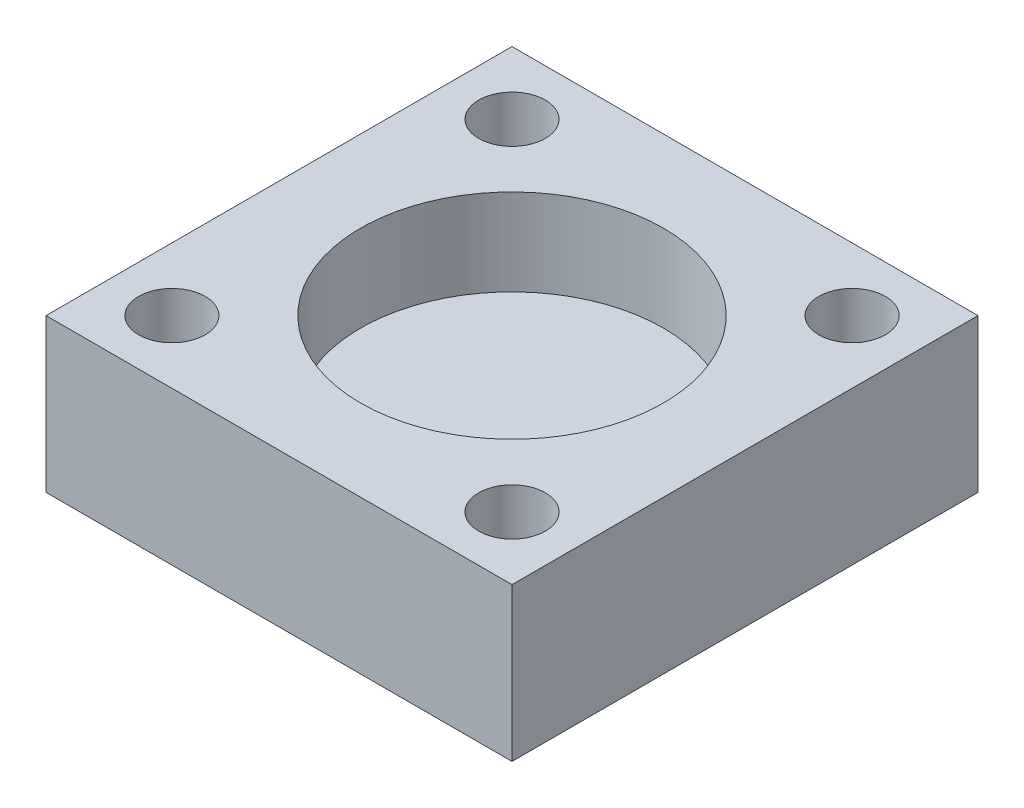
ISO-10303-21;
HEADER;
FILE_DESCRIPTION(('STEP AP214'),'2;1');
FILE_NAME('part.step','',(''),(''),'','','');
FILE_SCHEMA(('AUTOMOTIVE_DESIGN { 1 0 10303 214 1 1 1 1 }'));
ENDSEC;
DATA;
#1=APPLICATION_CONTEXT('core data for automotive mechanical design processes');
#2=APPLICATION_PROTOCOL_DEFINITION('international standard','automotive_design',2000,#1);
#3=PRODUCT_CONTEXT('',#1,'mechanical');
#4=PRODUCT('Part','Part','',(#3));
#5=PRODUCT_RELATED_PRODUCT_CATEGORY('part','',(#4));
#6=PRODUCT_DEFINITION_FORMATION('','',#4);
#7=PRODUCT_DEFINITION_CONTEXT('part definition',#1,'design');
#8=PRODUCT_DEFINITION('design','',#6,#7);
#9=PRODUCT_DEFINITION_SHAPE('','',#8);
#10=(LENGTH_UNIT() NAMED_UNIT(*) SI_UNIT(.MILLI.,.METRE.));
#11=(NAMED_UNIT(*) PLANE_ANGLE_UNIT() SI_UNIT($,.RADIAN.));
#12=(NAMED_UNIT(*) SI_UNIT($,.STERADIAN.) SOLID_ANGLE_UNIT());
#13=UNCERTAINTY_MEASURE_WITH_UNIT(LENGTH_MEASURE(1.E-05),#10,'distance_accuracy_value','');
#14=(GEOMETRIC_REPRESENTATION_CONTEXT(3) GLOBAL_UNCERTAINTY_ASSIGNED_CONTEXT((#13)) GLOBAL_UNIT_ASSIGNED_CONTEXT((#10,
#11,#12)) REPRESENTATION_CONTEXT('',''));
#15=CARTESIAN_POINT('',(0.,0.,0.));
#16=DIRECTION('',(0.,0.,1.));
#17=DIRECTION('',(1.,0.,0.));
#18=AXIS2_PLACEMENT_3D('',#15,#16,#17);
#19=CARTESIAN_POINT('',(0.,5.2,0.));
#20=DIRECTION('',(0.,1.,0.));
#21=DIRECTION('',(0.,0.,1.));
#22=AXIS2_PLACEMENT_3D('',#19,#20,#21);
#23=PLANE('',#22);
#24=CARTESIAN_POINT('',(-10.2173358543988,5.2,10.2173358543988));
#25=DIRECTION('',(0.,1.,0.));
#26=DIRECTION('',(0.,0.,1.));
#27=AXIS2_PLACEMENT_3D('',#24,#25,#26);
#28=CIRCLE('',#27,2.);
#29=CARTESIAN_POINT('',(-10.2173358543988,5.2,12.2173358543988));
#30=VERTEX_POINT('',#29);
#31=EDGE_CURVE('E162',#30,#30,#28,.F.);
#32=ORIENTED_EDGE('',*,*,#31,.T.);
#33=EDGE_LOOP('',(#32));
#34=FACE_BOUND('',#33,.T.);
#35=CARTESIAN_POINT('',(10.2173358543988,5.2,10.2173358543988));
#36=DIRECTION('',(0.,1.,0.));
#37=DIRECTION('',(0.,0.,1.));
#38=AXIS2_PLACEMENT_3D('',#35,#36,#37);
#39=CIRCLE('',#38,2.);
#40=CARTESIAN_POINT('',(10.2173358543988,5.2,12.2173358543988));
#41=VERTEX_POINT('',#40);
#42=EDGE_CURVE('E159',#41,#41,#39,.T.);
#43=ORIENTED_EDGE('',*,*,#42,.F.);
#44=EDGE_LOOP('',(#43));
#45=FACE_BOUND('',#44,.T.);
#46=CARTESIAN_POINT('',(0.,5.2,0.));
#47=DIRECTION('',(0.,1.,0.));
#48=DIRECTION('',(0.,0.,1.));
#49=AXIS2_PLACEMENT_3D('',#46,#47,#48);
#50=CIRCLE('',#49,9.09999999999999);
#51=CARTESIAN_POINT('',(0.,5.2,9.09999999999999));
#52=VERTEX_POINT('',#51);
#53=EDGE_CURVE('E170',#52,#52,#50,.T.);
#54=ORIENTED_EDGE('',*,*,#53,.F.);
#55=EDGE_LOOP('',(#54));
#56=FACE_BOUND('',#55,.T.);
#57=DIRECTION('',(-1.,0.,0.));
#58=VECTOR('',#57,1.);
#59=CARTESIAN_POINT('',(0.,5.2,-14.));
#60=LINE('',#59,#58);
#61=CARTESIAN_POINT('',(14.,5.2,-14.));
#62=VERTEX_POINT('',#61);
#63=CARTESIAN_POINT('',(-14.,5.2,-14.));
#64=VERTEX_POINT('',#63);
#65=EDGE_CURVE('E173',#62,#64,#60,.T.);
#66=ORIENTED_EDGE('',*,*,#65,.T.);
#67=DIRECTION('',(0.,0.,1.));
#68=VECTOR('',#67,1.);
#69=CARTESIAN_POINT('',(-14.,5.2,0.));
#70=LINE('',#69,#68);
#71=CARTESIAN_POINT('',(-14.,5.2,14.));
#72=VERTEX_POINT('',#71);
#73=EDGE_CURVE('E143',#64,#72,#70,.T.);
#74=ORIENTED_EDGE('',*,*,#73,.T.);
#75=DIRECTION('',(-1.,0.,0.));
#76=VECTOR('',#75,1.);
#77=CARTESIAN_POINT('',(0.,5.2,14.));
#78=LINE('',#77,#76);
#79=CARTESIAN_POINT('',(14.,5.2,14.));
#80=VERTEX_POINT('',#79);
#81=EDGE_CURVE('E176',#80,#72,#78,.T.);
#82=ORIENTED_EDGE('',*,*,#81,.F.);
#83=DIRECTION('',(0.,0.,1.));
#84=VECTOR('',#83,1.);
#85=CARTESIAN_POINT('',(14.,5.2,0.));
#86=LINE('',#85,#84);
#87=EDGE_CURVE('E178',#62,#80,#86,.T.);
#88=ORIENTED_EDGE('',*,*,#87,.F.);
#89=EDGE_LOOP('',(#66,#74,#82,#88));
#90=FACE_BOUND('',#89,.T.);
#91=CARTESIAN_POINT('',(-10.2173358543988,5.2,-10.2173358543988));
#92=DIRECTION('',(0.,1.,0.));
#93=DIRECTION('',(0.,0.,1.));
#94=AXIS2_PLACEMENT_3D('',#91,#92,#93);
#95=CIRCLE('',#94,2.);
#96=CARTESIAN_POINT('',(-10.2173358543988,5.2,-8.21733585439878));
#97=VERTEX_POINT('',#96);
#98=EDGE_CURVE('E273',#97,#97,#95,.T.);
#99=ORIENTED_EDGE('',*,*,#98,.F.);
#100=EDGE_LOOP('',(#99));
#101=FACE_BOUND('',#100,.T.);
#102=CARTESIAN_POINT('',(10.2173358543988,5.2,-10.2173358543988));
#103=DIRECTION('',(0.,1.,0.));
#104=DIRECTION('',(0.,0.,1.));
#105=AXIS2_PLACEMENT_3D('',#102,#103,#104);
#106=CIRCLE('',#105,2.);
#107=CARTESIAN_POINT('',(10.2173358543988,5.2,-8.21733585439878));
#108=VERTEX_POINT('',#107);
#109=EDGE_CURVE('E271',#108,#108,#106,.F.);
#110=ORIENTED_EDGE('',*,*,#109,.T.);
#111=EDGE_LOOP('',(#110));
#112=FACE_BOUND('',#111,.T.);
#113=ADVANCED_FACE('F95',(#34,#45,#56,#90,#101,#112),#23,.T.);
#114=CARTESIAN_POINT('',(0.,-4.,0.));
#115=DIRECTION('',(0.,1.,0.));
#116=DIRECTION('',(0.,0.,1.));
#117=AXIS2_PLACEMENT_3D('',#114,#115,#116);
#118=PLANE('',#117);
#119=CARTESIAN_POINT('',(10.2173358543988,-4.,10.2173358543988));
#120=DIRECTION('',(0.,1.,0.));
#121=DIRECTION('',(0.,0.,1.));
#122=AXIS2_PLACEMENT_3D('',#119,#120,#121);
#123=CIRCLE('',#122,3.);
#124=CARTESIAN_POINT('',(10.2173358543988,-4.,13.2173358543988));
#125=VERTEX_POINT('',#124);
#126=EDGE_CURVE('E193',#125,#125,#123,.T.);
#127=ORIENTED_EDGE('',*,*,#126,.T.);
#128=EDGE_LOOP('',(#127));
#129=FACE_BOUND('',#128,.T.);
#130=CARTESIAN_POINT('',(10.2173358543988,-4.,-10.2173358543988));
#131=DIRECTION('',(0.,1.,0.));
#132=DIRECTION('',(0.,0.,1.));
#133=AXIS2_PLACEMENT_3D('',#130,#131,#132);
#134=CIRCLE('',#133,3.);
#135=CARTESIAN_POINT('',(10.2173358543988,-4.,-7.21733585439879));
#136=VERTEX_POINT('',#135);
#137=EDGE_CURVE('E190',#136,#136,#134,.T.);
#138=ORIENTED_EDGE('',*,*,#137,.T.);
#139=EDGE_LOOP('',(#138));
#140=FACE_BOUND('',#139,.T.);
#141=CARTESIAN_POINT('',(-10.2173358543988,-4.,10.2173358543988));
#142=DIRECTION('',(0.,1.,0.));
#143=DIRECTION('',(0.,0.,1.));
#144=AXIS2_PLACEMENT_3D('',#141,#142,#143);
#145=CIRCLE('',#144,3.);
#146=CARTESIAN_POINT('',(-10.2173358543988,-4.,13.2173358543988));
#147=VERTEX_POINT('',#146);
#148=EDGE_CURVE('E187',#147,#147,#145,.T.);
#149=ORIENTED_EDGE('',*,*,#148,.T.);
#150=EDGE_LOOP('',(#149));
#151=FACE_BOUND('',#150,.T.);
#152=CARTESIAN_POINT('',(-10.2173358543988,-4.,-10.2173358543988));
#153=DIRECTION('',(0.,1.,0.));
#154=DIRECTION('',(0.,0.,1.));
#155=AXIS2_PLACEMENT_3D('',#152,#153,#154);
#156=CIRCLE('',#155,3.);
#157=CARTESIAN_POINT('',(-10.2173358543988,-4.,-7.21733585439879));
#158=VERTEX_POINT('',#157);
#159=EDGE_CURVE('E147',#158,#158,#156,.T.);
#160=ORIENTED_EDGE('',*,*,#159,.T.);
#161=EDGE_LOOP('',(#160));
#162=FACE_BOUND('',#161,.T.);
#163=DIRECTION('',(-1.,0.,0.));
#164=VECTOR('',#163,1.);
#165=CARTESIAN_POINT('',(0.,-4.,-14.));
#166=LINE('',#165,#164);
#167=CARTESIAN_POINT('',(14.,-4.,-14.));
#168=VERTEX_POINT('',#167);
#169=CARTESIAN_POINT('',(-14.,-4.,-14.));
#170=VERTEX_POINT('',#169);
#171=EDGE_CURVE('E155',#168,#170,#166,.T.);
#172=ORIENTED_EDGE('',*,*,#171,.F.);
#173=DIRECTION('',(0.,0.,1.));
#174=VECTOR('',#173,1.);
#175=CARTESIAN_POINT('',(14.,-4.,0.));
#176=LINE('',#175,#174);
#177=CARTESIAN_POINT('',(14.,-4.,14.));
#178=VERTEX_POINT('',#177);
#179=EDGE_CURVE('E167',#168,#178,#176,.T.);
#180=ORIENTED_EDGE('',*,*,#179,.T.);
#181=DIRECTION('',(-1.,0.,0.));
#182=VECTOR('',#181,1.);
#183=CARTESIAN_POINT('',(0.,-4.,14.));
#184=LINE('',#183,#182);
#185=CARTESIAN_POINT('',(-14.,-4.,14.));
#186=VERTEX_POINT('',#185);
#187=EDGE_CURVE('E156',#178,#186,#184,.T.);
#188=ORIENTED_EDGE('',*,*,#187,.T.);
#189=DIRECTION('',(0.,0.,1.));
#190=VECTOR('',#189,1.);
#191=CARTESIAN_POINT('',(-14.,-4.,0.));
#192=LINE('',#191,#190);
#193=EDGE_CURVE('E142',#170,#186,#192,.T.);
#194=ORIENTED_EDGE('',*,*,#193,.F.);
#195=EDGE_LOOP('',(#172,#180,#188,#194));
#196=FACE_BOUND('',#195,.T.);
#197=ADVANCED_FACE('F153',(#129,#140,#151,#162,#196),#118,.F.);
#198=CARTESIAN_POINT('',(0.,5.2,0.));
#199=DIRECTION('',(0.,-1.,0.));
#200=DIRECTION('',(0.,0.,-1.));
#201=AXIS2_PLACEMENT_3D('',#198,#199,#200);
#202=CYLINDRICAL_SURFACE('',#201,9.09999999999999);
#203=ORIENTED_EDGE('',*,*,#53,.T.);
#204=EDGE_LOOP('',(#203));
#205=FACE_BOUND('',#204,.T.);
#206=CARTESIAN_POINT('',(0.,0.,0.));
#207=DIRECTION('',(0.,1.,0.));
#208=DIRECTION('',(0.,0.,1.));
#209=AXIS2_PLACEMENT_3D('',#206,#207,#208);
#210=CIRCLE('',#209,9.09999999999999);
#211=CARTESIAN_POINT('',(0.,0.,9.09999999999999));
#212=VERTEX_POINT('',#211);
#213=EDGE_CURVE('E169',#212,#212,#210,.T.);
#214=ORIENTED_EDGE('',*,*,#213,.F.);
#215=EDGE_LOOP('',(#214));
#216=FACE_BOUND('',#215,.T.);
#217=ADVANCED_FACE('F227',(#205,#216),#202,.F.);
#218=CARTESIAN_POINT('',(-14.,5.2,0.));
#219=DIRECTION('',(1.,0.,0.));
#220=DIRECTION('',(0.,0.,-1.));
#221=AXIS2_PLACEMENT_3D('',#218,#219,#220);
#222=PLANE('',#221);
#223=DIRECTION('',(0.,-1.,0.));
#224=VECTOR('',#223,1.);
#225=CARTESIAN_POINT('',(-14.,5.2,-14.));
#226=LINE('',#225,#224);
#227=EDGE_CURVE('E138',#64,#170,#226,.T.);
#228=ORIENTED_EDGE('',*,*,#227,.T.);
#229=ORIENTED_EDGE('',*,*,#193,.T.);
#230=DIRECTION('',(0.,-1.,0.));
#231=VECTOR('',#230,1.);
#232=CARTESIAN_POINT('',(-14.,5.2,14.));
#233=LINE('',#232,#231);
#234=EDGE_CURVE('E148',#72,#186,#233,.T.);
#235=ORIENTED_EDGE('',*,*,#234,.F.);
#236=ORIENTED_EDGE('',*,*,#73,.F.);
#237=EDGE_LOOP('',(#228,#229,#235,#236));
#238=FACE_BOUND('',#237,.T.);
#239=ADVANCED_FACE('F140',(#238),#222,.F.);
#240=CARTESIAN_POINT('',(0.,5.2,-14.));
#241=DIRECTION('',(0.,0.,1.));
#242=DIRECTION('',(1.,0.,0.));
#243=AXIS2_PLACEMENT_3D('',#240,#241,#242);
#244=PLANE('',#243);
#245=DIRECTION('',(0.,-1.,0.));
#246=VECTOR('',#245,1.);
#247=CARTESIAN_POINT('',(14.,5.2,-14.));
#248=LINE('',#247,#246);
#249=EDGE_CURVE('E110',#62,#168,#248,.T.);
#250=ORIENTED_EDGE('',*,*,#249,.T.);
#251=ORIENTED_EDGE('',*,*,#171,.T.);
#252=ORIENTED_EDGE('',*,*,#227,.F.);
#253=ORIENTED_EDGE('',*,*,#65,.F.);
#254=EDGE_LOOP('',(#250,#251,#252,#253));
#255=FACE_BOUND('',#254,.T.);
#256=ADVANCED_FACE('F158',(#255),#244,.F.);
#257=CARTESIAN_POINT('',(14.,5.2,0.));
#258=DIRECTION('',(1.,0.,0.));
#259=DIRECTION('',(0.,0.,-1.));
#260=AXIS2_PLACEMENT_3D('',#257,#258,#259);
#261=PLANE('',#260);
#262=DIRECTION('',(0.,-1.,0.));
#263=VECTOR('',#262,1.);
#264=CARTESIAN_POINT('',(14.,5.2,14.));
#265=LINE('',#264,#263);
#266=EDGE_CURVE('E118',#80,#178,#265,.T.);
#267=ORIENTED_EDGE('',*,*,#266,.T.);
#268=ORIENTED_EDGE('',*,*,#179,.F.);
#269=ORIENTED_EDGE('',*,*,#249,.F.);
#270=ORIENTED_EDGE('',*,*,#87,.T.);
#271=EDGE_LOOP('',(#267,#268,#269,#270));
#272=FACE_BOUND('',#271,.T.);
#273=ADVANCED_FACE('F235',(#272),#261,.T.);
#274=CARTESIAN_POINT('',(0.,5.2,14.));
#275=DIRECTION('',(0.,0.,1.));
#276=DIRECTION('',(1.,0.,0.));
#277=AXIS2_PLACEMENT_3D('',#274,#275,#276);
#278=PLANE('',#277);
#279=ORIENTED_EDGE('',*,*,#234,.T.);
#280=ORIENTED_EDGE('',*,*,#187,.F.);
#281=ORIENTED_EDGE('',*,*,#266,.F.);
#282=ORIENTED_EDGE('',*,*,#81,.T.);
#283=EDGE_LOOP('',(#279,#280,#281,#282));
#284=FACE_BOUND('',#283,.T.);
#285=ADVANCED_FACE('F238',(#284),#278,.T.);
#286=CARTESIAN_POINT('',(0.,0.,0.));
#287=DIRECTION('',(0.,1.,0.));
#288=DIRECTION('',(0.,0.,1.));
#289=AXIS2_PLACEMENT_3D('',#286,#287,#288);
#290=PLANE('',#289);
#291=ORIENTED_EDGE('',*,*,#213,.T.);
#292=EDGE_LOOP('',(#291));
#293=FACE_BOUND('',#292,.T.);
#294=ADVANCED_FACE('F234',(#293),#290,.T.);
#295=CARTESIAN_POINT('',(10.2173358543988,-4.,10.2173358543988));
#296=DIRECTION('',(0.,1.,0.));
#297=DIRECTION('',(0.,0.,1.));
#298=AXIS2_PLACEMENT_3D('',#295,#296,#297);
#299=CYLINDRICAL_SURFACE('',#298,2.);
#300=CARTESIAN_POINT('',(10.2173358543988,-3.,10.2173358543988));
#301=DIRECTION('',(0.,1.,0.));
#302=DIRECTION('',(0.,0.,1.));
#303=AXIS2_PLACEMENT_3D('',#300,#301,#302);
#304=CIRCLE('',#303,2.);
#305=CARTESIAN_POINT('',(10.2173358543988,-3.,12.2173358543988));
#306=VERTEX_POINT('',#305);
#307=EDGE_CURVE('E196',#306,#306,#304,.F.);
#308=ORIENTED_EDGE('',*,*,#307,.T.);
#309=EDGE_LOOP('',(#308));
#310=FACE_BOUND('',#309,.T.);
#311=ORIENTED_EDGE('',*,*,#42,.T.);
#312=EDGE_LOOP('',(#311));
#313=FACE_BOUND('',#312,.T.);
#314=ADVANCED_FACE('F279',(#310,#313),#299,.F.);
#315=CARTESIAN_POINT('',(-10.2173358543988,-4.,10.2173358543988));
#316=DIRECTION('',(0.,1.,0.));
#317=DIRECTION('',(0.,0.,1.));
#318=AXIS2_PLACEMENT_3D('',#315,#316,#317);
#319=CYLINDRICAL_SURFACE('',#318,2.);
#320=CARTESIAN_POINT('',(-10.2173358543988,-3.,10.2173358543988));
#321=DIRECTION('',(0.,1.,0.));
#322=DIRECTION('',(0.,0.,1.));
#323=AXIS2_PLACEMENT_3D('',#320,#321,#322);
#324=CIRCLE('',#323,2.);
#325=CARTESIAN_POINT('',(-10.2173358543988,-3.,12.2173358543988));
#326=VERTEX_POINT('',#325);
#327=EDGE_CURVE('E103',#326,#326,#324,.F.);
#328=ORIENTED_EDGE('',*,*,#327,.T.);
#329=EDGE_LOOP('',(#328));
#330=FACE_BOUND('',#329,.T.);
#331=ORIENTED_EDGE('',*,*,#31,.F.);
#332=EDGE_LOOP('',(#331));
#333=FACE_BOUND('',#332,.T.);
#334=ADVANCED_FACE('F204',(#330,#333),#319,.F.);
#335=CARTESIAN_POINT('',(-10.2173358543988,-4.,-10.2173358543988));
#336=DIRECTION('',(0.,1.,0.));
#337=DIRECTION('',(0.,0.,1.));
#338=AXIS2_PLACEMENT_3D('',#335,#336,#337);
#339=CYLINDRICAL_SURFACE('',#338,2.);
#340=CARTESIAN_POINT('',(-10.2173358543988,-3.,-10.2173358543988));
#341=DIRECTION('',(0.,1.,0.));
#342=DIRECTION('',(0.,0.,1.));
#343=AXIS2_PLACEMENT_3D('',#340,#341,#342);
#344=CIRCLE('',#343,2.);
#345=CARTESIAN_POINT('',(-10.2173358543988,-3.,-8.21733585439878));
#346=VERTEX_POINT('',#345);
#347=EDGE_CURVE('E12',#346,#346,#344,.F.);
#348=ORIENTED_EDGE('',*,*,#347,.T.);
#349=EDGE_LOOP('',(#348));
#350=FACE_BOUND('',#349,.T.);
#351=ORIENTED_EDGE('',*,*,#98,.T.);
#352=EDGE_LOOP('',(#351));
#353=FACE_BOUND('',#352,.T.);
#354=ADVANCED_FACE('F254',(#350,#353),#339,.F.);
#355=CARTESIAN_POINT('',(10.2173358543988,-4.,-10.2173358543988));
#356=DIRECTION('',(0.,1.,0.));
#357=DIRECTION('',(0.,0.,1.));
#358=AXIS2_PLACEMENT_3D('',#355,#356,#357);
#359=CYLINDRICAL_SURFACE('',#358,2.);
#360=CARTESIAN_POINT('',(10.2173358543988,-3.,-10.2173358543988));
#361=DIRECTION('',(0.,1.,0.));
#362=DIRECTION('',(0.,0.,1.));
#363=AXIS2_PLACEMENT_3D('',#360,#361,#362);
#364=CIRCLE('',#363,2.);
#365=CARTESIAN_POINT('',(10.2173358543988,-3.,-8.21733585439878));
#366=VERTEX_POINT('',#365);
#367=EDGE_CURVE('E199',#366,#366,#364,.F.);
#368=ORIENTED_EDGE('',*,*,#367,.T.);
#369=EDGE_LOOP('',(#368));
#370=FACE_BOUND('',#369,.T.);
#371=ORIENTED_EDGE('',*,*,#109,.F.);
#372=EDGE_LOOP('',(#371));
#373=FACE_BOUND('',#372,.T.);
#374=ADVANCED_FACE('F249',(#370,#373),#359,.F.);
#375=CARTESIAN_POINT('',(10.2173358543988,-3.,10.2173358543988));
#376=DIRECTION('',(0.,1.,0.));
#377=DIRECTION('',(0.,0.,1.));
#378=AXIS2_PLACEMENT_3D('',#375,#376,#377);
#379=TOROIDAL_SURFACE('',#378,3.,1.);
#380=ORIENTED_EDGE('',*,*,#307,.F.);
#381=EDGE_LOOP('',(#380));
#382=FACE_BOUND('',#381,.T.);
#383=ORIENTED_EDGE('',*,*,#126,.F.);
#384=EDGE_LOOP('',(#383));
#385=FACE_BOUND('',#384,.T.);
#386=ADVANCED_FACE('F216',(#382,#385),#379,.T.);
#387=CARTESIAN_POINT('',(10.2173358543988,-3.,-10.2173358543988));
#388=DIRECTION('',(0.,1.,0.));
#389=DIRECTION('',(0.,0.,1.));
#390=AXIS2_PLACEMENT_3D('',#387,#388,#389);
#391=TOROIDAL_SURFACE('',#390,3.,1.);
#392=ORIENTED_EDGE('',*,*,#137,.F.);
#393=EDGE_LOOP('',(#392));
#394=FACE_BOUND('',#393,.T.);
#395=ORIENTED_EDGE('',*,*,#367,.F.);
#396=EDGE_LOOP('',(#395));
#397=FACE_BOUND('',#396,.T.);
#398=ADVANCED_FACE('F209',(#394,#397),#391,.T.);
#399=CARTESIAN_POINT('',(-10.2173358543988,-3.,10.2173358543988));
#400=DIRECTION('',(0.,1.,0.));
#401=DIRECTION('',(0.,0.,1.));
#402=AXIS2_PLACEMENT_3D('',#399,#400,#401);
#403=TOROIDAL_SURFACE('',#402,3.,1.);
#404=ORIENTED_EDGE('',*,*,#148,.F.);
#405=EDGE_LOOP('',(#404));
#406=FACE_BOUND('',#405,.T.);
#407=ORIENTED_EDGE('',*,*,#327,.F.);
#408=EDGE_LOOP('',(#407));
#409=FACE_BOUND('',#408,.T.);
#410=ADVANCED_FACE('F207',(#406,#409),#403,.T.);
#411=CARTESIAN_POINT('',(-10.2173358543988,-3.,-10.2173358543988));
#412=DIRECTION('',(0.,1.,0.));
#413=DIRECTION('',(0.,0.,1.));
#414=AXIS2_PLACEMENT_3D('',#411,#412,#413);
#415=TOROIDAL_SURFACE('',#414,3.,1.);
#416=ORIENTED_EDGE('',*,*,#347,.F.);
#417=EDGE_LOOP('',(#416));
#418=FACE_BOUND('',#417,.T.);
#419=ORIENTED_EDGE('',*,*,#159,.F.);
#420=EDGE_LOOP('',(#419));
#421=FACE_BOUND('',#420,.T.);
#422=ADVANCED_FACE('F97',(#418,#421),#415,.T.);
#423=CLOSED_SHELL('',(#113,#197,#217,#239,#256,#273,#285,#294,#314,#334,#354,#374,#386,#398,
#410,#422));
#424=MANIFOLD_SOLID_BREP('B2',#423);
#425=ADVANCED_BREP_SHAPE_REPRESENTATION('',(#18,#424),#14);
#426=SHAPE_DEFINITION_REPRESENTATION(#9,#425);
ENDSEC;
END-ISO-10303-21;
